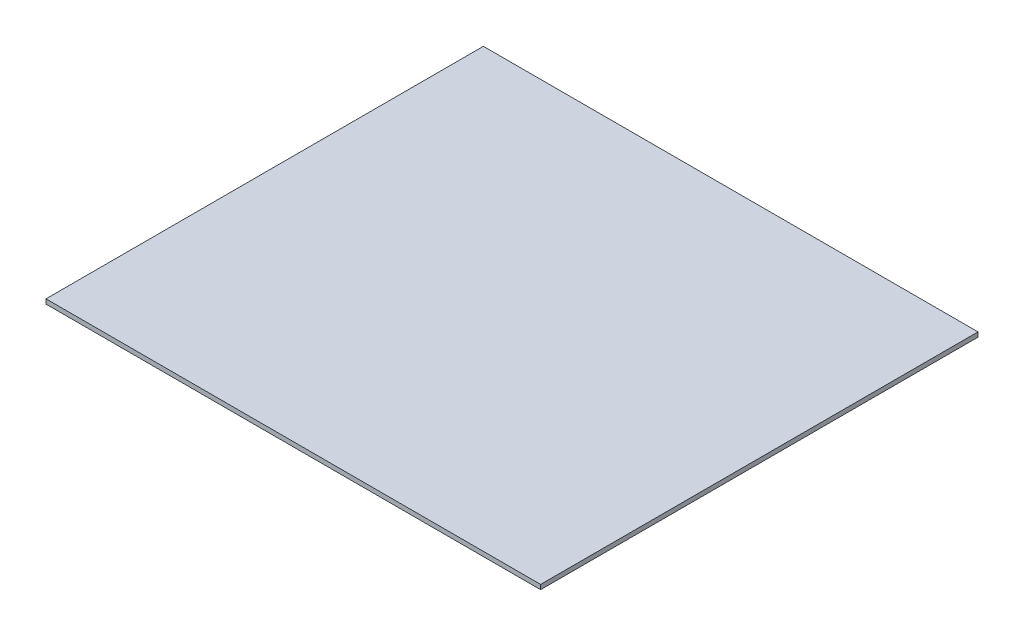
ISO-10303-21;
HEADER;
FILE_DESCRIPTION(('STEP AP214'),'2;1');
FILE_NAME('part.step','',(''),(''),'','','');
FILE_SCHEMA(('AUTOMOTIVE_DESIGN { 1 0 10303 214 1 1 1 1 }'));
ENDSEC;
DATA;
#1=APPLICATION_CONTEXT('core data for automotive mechanical design processes');
#2=APPLICATION_PROTOCOL_DEFINITION('international standard','automotive_design',2000,#1);
#3=PRODUCT_CONTEXT('',#1,'mechanical');
#4=PRODUCT('Part','Part','',(#3));
#5=PRODUCT_RELATED_PRODUCT_CATEGORY('part','',(#4));
#6=PRODUCT_DEFINITION_FORMATION('','',#4);
#7=PRODUCT_DEFINITION_CONTEXT('part definition',#1,'design');
#8=PRODUCT_DEFINITION('design','',#6,#7);
#9=PRODUCT_DEFINITION_SHAPE('','',#8);
#10=(LENGTH_UNIT() NAMED_UNIT(*) SI_UNIT(.MILLI.,.METRE.));
#11=(NAMED_UNIT(*) PLANE_ANGLE_UNIT() SI_UNIT($,.RADIAN.));
#12=(NAMED_UNIT(*) SI_UNIT($,.STERADIAN.) SOLID_ANGLE_UNIT());
#13=UNCERTAINTY_MEASURE_WITH_UNIT(LENGTH_MEASURE(1.E-05),#10,'distance_accuracy_value','');
#14=(GEOMETRIC_REPRESENTATION_CONTEXT(3) GLOBAL_UNCERTAINTY_ASSIGNED_CONTEXT((#13)) GLOBAL_UNIT_ASSIGNED_CONTEXT((#10,
#11,#12)) REPRESENTATION_CONTEXT('',''));
#15=CARTESIAN_POINT('',(0.,0.,0.));
#16=DIRECTION('',(0.,0.,1.));
#17=DIRECTION('',(1.,0.,0.));
#18=AXIS2_PLACEMENT_3D('',#15,#16,#17);
#19=CARTESIAN_POINT('',(-287.221188118812,6.35,371.487574257426));
#20=DIRECTION('',(0.,0.,-1.));
#21=DIRECTION('',(-1.,0.,0.));
#22=AXIS2_PLACEMENT_3D('',#19,#20,#21);
#23=PLANE('',#22);
#24=DIRECTION('',(1.,0.,0.));
#25=VECTOR('',#24,1.);
#26=CARTESIAN_POINT('',(-287.221188118812,0.,371.487574257426));
#27=LINE('',#26,#25);
#28=CARTESIAN_POINT('',(-287.221188118812,0.,371.487574257426));
#29=VERTEX_POINT('',#28);
#30=CARTESIAN_POINT('',(398.578811881188,0.,371.487574257426));
#31=VERTEX_POINT('',#30);
#32=EDGE_CURVE('E107',#29,#31,#27,.T.);
#33=ORIENTED_EDGE('',*,*,#32,.T.);
#34=DIRECTION('',(0.,-1.,0.));
#35=VECTOR('',#34,1.);
#36=CARTESIAN_POINT('',(398.578811881188,6.35,371.487574257426));
#37=LINE('',#36,#35);
#38=CARTESIAN_POINT('',(398.578811881188,6.35,371.487574257426));
#39=VERTEX_POINT('',#38);
#40=EDGE_CURVE('E11',#39,#31,#37,.T.);
#41=ORIENTED_EDGE('',*,*,#40,.F.);
#42=DIRECTION('',(1.,0.,0.));
#43=VECTOR('',#42,1.);
#44=CARTESIAN_POINT('',(-287.221188118812,6.35,371.487574257426));
#45=LINE('',#44,#43);
#46=CARTESIAN_POINT('',(-287.221188118812,6.35,371.487574257426));
#47=VERTEX_POINT('',#46);
#48=EDGE_CURVE('E89',#47,#39,#45,.T.);
#49=ORIENTED_EDGE('',*,*,#48,.F.);
#50=DIRECTION('',(0.,-1.,0.));
#51=VECTOR('',#50,1.);
#52=CARTESIAN_POINT('',(-287.221188118812,6.35,371.487574257426));
#53=LINE('',#52,#51);
#54=EDGE_CURVE('E56',#47,#29,#53,.T.);
#55=ORIENTED_EDGE('',*,*,#54,.T.);
#56=EDGE_LOOP('',(#33,#41,#49,#55));
#57=FACE_BOUND('',#56,.T.);
#58=ADVANCED_FACE('F39',(#57),#23,.F.);
#59=CARTESIAN_POINT('',(398.578811881188,6.35,371.487574257426));
#60=DIRECTION('',(-1.,0.,0.));
#61=DIRECTION('',(0.,0.,1.));
#62=AXIS2_PLACEMENT_3D('',#59,#60,#61);
#63=PLANE('',#62);
#64=DIRECTION('',(0.,0.,-1.));
#65=VECTOR('',#64,1.);
#66=CARTESIAN_POINT('',(398.578811881188,0.,371.487574257426));
#67=LINE('',#66,#65);
#68=CARTESIAN_POINT('',(398.578811881188,0.,-234.937425742574));
#69=VERTEX_POINT('',#68);
#70=EDGE_CURVE('E95',#31,#69,#67,.T.);
#71=ORIENTED_EDGE('',*,*,#70,.T.);
#72=DIRECTION('',(0.,-1.,0.));
#73=VECTOR('',#72,1.);
#74=CARTESIAN_POINT('',(398.578811881188,6.35,-234.937425742574));
#75=LINE('',#74,#73);
#76=CARTESIAN_POINT('',(398.578811881188,6.35,-234.937425742574));
#77=VERTEX_POINT('',#76);
#78=EDGE_CURVE('E48',#77,#69,#75,.T.);
#79=ORIENTED_EDGE('',*,*,#78,.F.);
#80=DIRECTION('',(0.,0.,-1.));
#81=VECTOR('',#80,1.);
#82=CARTESIAN_POINT('',(398.578811881188,6.35,371.487574257426));
#83=LINE('',#82,#81);
#84=EDGE_CURVE('E81',#39,#77,#83,.T.);
#85=ORIENTED_EDGE('',*,*,#84,.F.);
#86=ORIENTED_EDGE('',*,*,#40,.T.);
#87=EDGE_LOOP('',(#71,#79,#85,#86));
#88=FACE_BOUND('',#87,.T.);
#89=ADVANCED_FACE('F94',(#88),#63,.F.);
#90=CARTESIAN_POINT('',(-287.221188118812,6.35,-234.937425742574));
#91=DIRECTION('',(0.,0.,-1.));
#92=DIRECTION('',(-1.,0.,0.));
#93=AXIS2_PLACEMENT_3D('',#90,#91,#92);
#94=PLANE('',#93);
#95=DIRECTION('',(1.,0.,0.));
#96=VECTOR('',#95,1.);
#97=CARTESIAN_POINT('',(-287.221188118812,0.,-234.937425742574));
#98=LINE('',#97,#96);
#99=CARTESIAN_POINT('',(-287.221188118812,0.,-234.937425742574));
#100=VERTEX_POINT('',#99);
#101=EDGE_CURVE('E112',#100,#69,#98,.T.);
#102=ORIENTED_EDGE('',*,*,#101,.F.);
#103=DIRECTION('',(0.,-1.,0.));
#104=VECTOR('',#103,1.);
#105=CARTESIAN_POINT('',(-287.221188118812,6.35,-234.937425742574));
#106=LINE('',#105,#104);
#107=CARTESIAN_POINT('',(-287.221188118812,6.35,-234.937425742574));
#108=VERTEX_POINT('',#107);
#109=EDGE_CURVE('E70',#108,#100,#106,.T.);
#110=ORIENTED_EDGE('',*,*,#109,.F.);
#111=DIRECTION('',(1.,0.,0.));
#112=VECTOR('',#111,1.);
#113=CARTESIAN_POINT('',(-287.221188118812,6.35,-234.937425742574));
#114=LINE('',#113,#112);
#115=EDGE_CURVE('E88',#108,#77,#114,.T.);
#116=ORIENTED_EDGE('',*,*,#115,.T.);
#117=ORIENTED_EDGE('',*,*,#78,.T.);
#118=EDGE_LOOP('',(#102,#110,#116,#117));
#119=FACE_BOUND('',#118,.T.);
#120=ADVANCED_FACE('F99',(#119),#94,.T.);
#121=CARTESIAN_POINT('',(-287.221188118812,6.35,371.487574257426));
#122=DIRECTION('',(-1.,0.,0.));
#123=DIRECTION('',(0.,0.,1.));
#124=AXIS2_PLACEMENT_3D('',#121,#122,#123);
#125=PLANE('',#124);
#126=DIRECTION('',(0.,0.,-1.));
#127=VECTOR('',#126,1.);
#128=CARTESIAN_POINT('',(-287.221188118812,0.,371.487574257426));
#129=LINE('',#128,#127);
#130=EDGE_CURVE('E115',#29,#100,#129,.T.);
#131=ORIENTED_EDGE('',*,*,#130,.F.);
#132=ORIENTED_EDGE('',*,*,#54,.F.);
#133=DIRECTION('',(0.,0.,-1.));
#134=VECTOR('',#133,1.);
#135=CARTESIAN_POINT('',(-287.221188118812,6.35,371.487574257426));
#136=LINE('',#135,#134);
#137=EDGE_CURVE('E101',#47,#108,#136,.T.);
#138=ORIENTED_EDGE('',*,*,#137,.T.);
#139=ORIENTED_EDGE('',*,*,#109,.T.);
#140=EDGE_LOOP('',(#131,#132,#138,#139));
#141=FACE_BOUND('',#140,.T.);
#142=ADVANCED_FACE('F125',(#141),#125,.T.);
#143=CARTESIAN_POINT('',(0.,6.35,0.));
#144=DIRECTION('',(0.,1.,0.));
#145=DIRECTION('',(0.,0.,1.));
#146=AXIS2_PLACEMENT_3D('',#143,#144,#145);
#147=PLANE('',#146);
#148=ORIENTED_EDGE('',*,*,#48,.T.);
#149=ORIENTED_EDGE('',*,*,#84,.T.);
#150=ORIENTED_EDGE('',*,*,#115,.F.);
#151=ORIENTED_EDGE('',*,*,#137,.F.);
#152=EDGE_LOOP('',(#148,#149,#150,#151));
#153=FACE_BOUND('',#152,.T.);
#154=ADVANCED_FACE('F85',(#153),#147,.T.);
#155=CARTESIAN_POINT('',(0.,0.,0.));
#156=DIRECTION('',(0.,1.,0.));
#157=DIRECTION('',(0.,0.,1.));
#158=AXIS2_PLACEMENT_3D('',#155,#156,#157);
#159=PLANE('',#158);
#160=ORIENTED_EDGE('',*,*,#32,.F.);
#161=ORIENTED_EDGE('',*,*,#130,.T.);
#162=ORIENTED_EDGE('',*,*,#101,.T.);
#163=ORIENTED_EDGE('',*,*,#70,.F.);
#164=EDGE_LOOP('',(#160,#161,#162,#163));
#165=FACE_BOUND('',#164,.T.);
#166=ADVANCED_FACE('F124',(#165),#159,.F.);
#167=CLOSED_SHELL('',(#58,#89,#120,#142,#154,#166));
#168=MANIFOLD_SOLID_BREP('B2',#167);
#169=ADVANCED_BREP_SHAPE_REPRESENTATION('',(#18,#168),#14);
#170=SHAPE_DEFINITION_REPRESENTATION(#9,#169);
ENDSEC;
END-ISO-10303-21;
